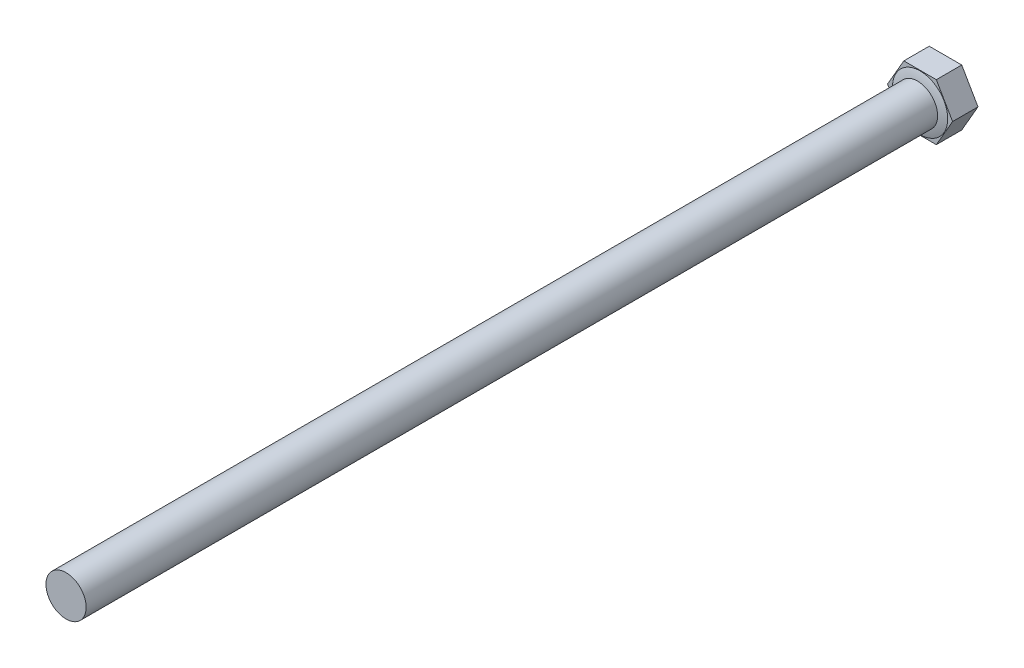
ISO-10303-21;
HEADER;
FILE_DESCRIPTION(('STEP AP214'),'2;1');
FILE_NAME('part.step','',(''),(''),'','','');
FILE_SCHEMA(('AUTOMOTIVE_DESIGN { 1 0 10303 214 1 1 1 1 }'));
ENDSEC;
DATA;
#1=APPLICATION_CONTEXT('core data for automotive mechanical design processes');
#2=APPLICATION_PROTOCOL_DEFINITION('international standard','automotive_design',2000,#1);
#3=PRODUCT_CONTEXT('',#1,'mechanical');
#4=PRODUCT('Part','Part','',(#3));
#5=PRODUCT_RELATED_PRODUCT_CATEGORY('part','',(#4));
#6=PRODUCT_DEFINITION_FORMATION('','',#4);
#7=PRODUCT_DEFINITION_CONTEXT('part definition',#1,'design');
#8=PRODUCT_DEFINITION('design','',#6,#7);
#9=PRODUCT_DEFINITION_SHAPE('','',#8);
#10=(LENGTH_UNIT() NAMED_UNIT(*) SI_UNIT(.MILLI.,.METRE.));
#11=(NAMED_UNIT(*) PLANE_ANGLE_UNIT() SI_UNIT($,.RADIAN.));
#12=(NAMED_UNIT(*) SI_UNIT($,.STERADIAN.) SOLID_ANGLE_UNIT());
#13=UNCERTAINTY_MEASURE_WITH_UNIT(LENGTH_MEASURE(1.E-05),#10,'distance_accuracy_value','');
#14=(GEOMETRIC_REPRESENTATION_CONTEXT(3) GLOBAL_UNCERTAINTY_ASSIGNED_CONTEXT((#13)) GLOBAL_UNIT_ASSIGNED_CONTEXT((#10,
#11,#12)) REPRESENTATION_CONTEXT('',''));
#15=CARTESIAN_POINT('',(0.,0.,0.));
#16=DIRECTION('',(0.,0.,1.));
#17=DIRECTION('',(1.,0.,0.));
#18=AXIS2_PLACEMENT_3D('',#15,#16,#17);
#19=CARTESIAN_POINT('',(3.15275904742978,-5.46073885417069,4.9276));
#20=DIRECTION('',(-0.866025403784441,0.499999999999995,0.));
#21=DIRECTION('',(-0.499999999999995,-0.866025403784442,0.));
#22=AXIS2_PLACEMENT_3D('',#19,#20,#21);
#23=PLANE('',#22);
#24=DIRECTION('',(0.499999999999995,0.866025403784442,0.));
#25=VECTOR('',#24,1.);
#26=CARTESIAN_POINT('',(3.15275904742978,-5.46073885417069,0.));
#27=LINE('',#26,#25);
#28=CARTESIAN_POINT('',(3.15275904742978,-5.46073885417069,0.));
#29=VERTEX_POINT('',#28);
#30=CARTESIAN_POINT('',(6.30551809485944,0.,0.));
#31=VERTEX_POINT('',#30);
#32=EDGE_CURVE('E132',#29,#31,#27,.T.);
#33=ORIENTED_EDGE('',*,*,#32,.T.);
#34=DIRECTION('',(0.,0.,-1.));
#35=VECTOR('',#34,1.);
#36=CARTESIAN_POINT('',(6.30551809485944,0.,4.9276));
#37=LINE('',#36,#35);
#38=CARTESIAN_POINT('',(6.30551809485944,0.,4.9276));
#39=VERTEX_POINT('',#38);
#40=EDGE_CURVE('E159',#39,#31,#37,.T.);
#41=ORIENTED_EDGE('',*,*,#40,.F.);
#42=DIRECTION('',(0.499999999999995,0.866025403784442,0.));
#43=VECTOR('',#42,1.);
#44=CARTESIAN_POINT('',(3.15275904742978,-5.46073885417069,4.9276));
#45=LINE('',#44,#43);
#46=CARTESIAN_POINT('',(3.15275904742978,-5.46073885417069,4.9276));
#47=VERTEX_POINT('',#46);
#48=EDGE_CURVE('E149',#47,#39,#45,.T.);
#49=ORIENTED_EDGE('',*,*,#48,.F.);
#50=DIRECTION('',(0.,0.,-1.));
#51=VECTOR('',#50,1.);
#52=CARTESIAN_POINT('',(3.15275904742978,-5.46073885417069,4.9276));
#53=LINE('',#52,#51);
#54=EDGE_CURVE('E128',#47,#29,#53,.T.);
#55=ORIENTED_EDGE('',*,*,#54,.T.);
#56=EDGE_LOOP('',(#33,#41,#49,#55));
#57=FACE_BOUND('',#56,.T.);
#58=ADVANCED_FACE('F41',(#57),#23,.F.);
#59=CARTESIAN_POINT('',(6.30551809485944,0.,4.9276));
#60=DIRECTION('',(-0.866025403784438,-0.500000000000001,0.));
#61=DIRECTION('',(0.500000000000001,-0.866025403784438,0.));
#62=AXIS2_PLACEMENT_3D('',#59,#60,#61);
#63=PLANE('',#62);
#64=DIRECTION('',(-0.500000000000001,0.866025403784438,0.));
#65=VECTOR('',#64,1.);
#66=CARTESIAN_POINT('',(6.30551809485944,0.,0.));
#67=LINE('',#66,#65);
#68=CARTESIAN_POINT('',(3.15275904742971,5.46073885417074,0.));
#69=VERTEX_POINT('',#68);
#70=EDGE_CURVE('E136',#31,#69,#67,.T.);
#71=ORIENTED_EDGE('',*,*,#70,.T.);
#72=DIRECTION('',(0.,0.,-1.));
#73=VECTOR('',#72,1.);
#74=CARTESIAN_POINT('',(3.15275904742971,5.46073885417074,4.9276));
#75=LINE('',#74,#73);
#76=CARTESIAN_POINT('',(3.15275904742971,5.46073885417074,4.9276));
#77=VERTEX_POINT('',#76);
#78=EDGE_CURVE('E156',#77,#69,#75,.T.);
#79=ORIENTED_EDGE('',*,*,#78,.F.);
#80=DIRECTION('',(-0.500000000000001,0.866025403784438,0.));
#81=VECTOR('',#80,1.);
#82=CARTESIAN_POINT('',(6.30551809485944,0.,4.9276));
#83=LINE('',#82,#81);
#84=EDGE_CURVE('E97',#39,#77,#83,.T.);
#85=ORIENTED_EDGE('',*,*,#84,.F.);
#86=ORIENTED_EDGE('',*,*,#40,.T.);
#87=EDGE_LOOP('',(#71,#79,#85,#86));
#88=FACE_BOUND('',#87,.T.);
#89=ADVANCED_FACE('F195',(#88),#63,.F.);
#90=CARTESIAN_POINT('',(3.15275904742971,5.46073885417074,4.9276));
#91=DIRECTION('',(0.,-1.,0.));
#92=DIRECTION('',(1.,0.,0.));
#93=AXIS2_PLACEMENT_3D('',#90,#91,#92);
#94=PLANE('',#93);
#95=DIRECTION('',(-1.,0.,0.));
#96=VECTOR('',#95,1.);
#97=CARTESIAN_POINT('',(3.15275904742971,5.46073885417074,0.));
#98=LINE('',#97,#96);
#99=CARTESIAN_POINT('',(-3.15275904742974,5.46073885417071,0.));
#100=VERTEX_POINT('',#99);
#101=EDGE_CURVE('E140',#69,#100,#98,.T.);
#102=ORIENTED_EDGE('',*,*,#101,.T.);
#103=DIRECTION('',(0.,0.,-1.));
#104=VECTOR('',#103,1.);
#105=CARTESIAN_POINT('',(-3.15275904742974,5.46073885417071,4.9276));
#106=LINE('',#105,#104);
#107=CARTESIAN_POINT('',(-3.15275904742974,5.46073885417071,4.9276));
#108=VERTEX_POINT('',#107);
#109=EDGE_CURVE('E121',#108,#100,#106,.T.);
#110=ORIENTED_EDGE('',*,*,#109,.F.);
#111=DIRECTION('',(-1.,0.,0.));
#112=VECTOR('',#111,1.);
#113=CARTESIAN_POINT('',(3.15275904742971,5.46073885417074,4.9276));
#114=LINE('',#113,#112);
#115=EDGE_CURVE('E110',#77,#108,#114,.T.);
#116=ORIENTED_EDGE('',*,*,#115,.F.);
#117=ORIENTED_EDGE('',*,*,#78,.T.);
#118=EDGE_LOOP('',(#102,#110,#116,#117));
#119=FACE_BOUND('',#118,.T.);
#120=ADVANCED_FACE('F200',(#119),#94,.F.);
#121=CARTESIAN_POINT('',(-3.15275904742974,5.46073885417071,4.9276));
#122=DIRECTION('',(0.866025403784441,-0.499999999999995,0.));
#123=DIRECTION('',(0.499999999999995,0.866025403784442,0.));
#124=AXIS2_PLACEMENT_3D('',#121,#122,#123);
#125=PLANE('',#124);
#126=DIRECTION('',(-0.499999999999995,-0.866025403784442,0.));
#127=VECTOR('',#126,1.);
#128=CARTESIAN_POINT('',(-3.15275904742974,5.46073885417071,0.));
#129=LINE('',#128,#127);
#130=CARTESIAN_POINT('',(-6.30551809485944,0.,0.));
#131=VERTEX_POINT('',#130);
#132=EDGE_CURVE('E119',#100,#131,#129,.T.);
#133=ORIENTED_EDGE('',*,*,#132,.T.);
#134=DIRECTION('',(0.,0.,-1.));
#135=VECTOR('',#134,1.);
#136=CARTESIAN_POINT('',(-6.30551809485944,0.,4.9276));
#137=LINE('',#136,#135);
#138=CARTESIAN_POINT('',(-6.30551809485944,0.,4.9276));
#139=VERTEX_POINT('',#138);
#140=EDGE_CURVE('E116',#139,#131,#137,.T.);
#141=ORIENTED_EDGE('',*,*,#140,.F.);
#142=DIRECTION('',(-0.499999999999995,-0.866025403784442,0.));
#143=VECTOR('',#142,1.);
#144=CARTESIAN_POINT('',(-3.15275904742974,5.46073885417071,4.9276));
#145=LINE('',#144,#143);
#146=EDGE_CURVE('E104',#108,#139,#145,.T.);
#147=ORIENTED_EDGE('',*,*,#146,.F.);
#148=ORIENTED_EDGE('',*,*,#109,.T.);
#149=EDGE_LOOP('',(#133,#141,#147,#148));
#150=FACE_BOUND('',#149,.T.);
#151=ADVANCED_FACE('F117',(#150),#125,.F.);
#152=CARTESIAN_POINT('',(-6.30551809485944,0.,4.9276));
#153=DIRECTION('',(0.866025403784435,0.500000000000007,0.));
#154=DIRECTION('',(-0.500000000000007,0.866025403784435,0.));
#155=AXIS2_PLACEMENT_3D('',#152,#153,#154);
#156=PLANE('',#155);
#157=DIRECTION('',(0.500000000000007,-0.866025403784435,0.));
#158=VECTOR('',#157,1.);
#159=CARTESIAN_POINT('',(-6.30551809485944,0.,0.));
#160=LINE('',#159,#158);
#161=CARTESIAN_POINT('',(-3.15275904742967,-5.46073885417076,0.));
#162=VERTEX_POINT('',#161);
#163=EDGE_CURVE('E82',#131,#162,#160,.T.);
#164=ORIENTED_EDGE('',*,*,#163,.T.);
#165=DIRECTION('',(0.,0.,-1.));
#166=VECTOR('',#165,1.);
#167=CARTESIAN_POINT('',(-3.15275904742967,-5.46073885417076,4.9276));
#168=LINE('',#167,#166);
#169=CARTESIAN_POINT('',(-3.15275904742967,-5.46073885417076,4.9276));
#170=VERTEX_POINT('',#169);
#171=EDGE_CURVE('E122',#170,#162,#168,.T.);
#172=ORIENTED_EDGE('',*,*,#171,.F.);
#173=DIRECTION('',(0.500000000000007,-0.866025403784435,0.));
#174=VECTOR('',#173,1.);
#175=CARTESIAN_POINT('',(-6.30551809485944,0.,4.9276));
#176=LINE('',#175,#174);
#177=EDGE_CURVE('E108',#139,#170,#176,.T.);
#178=ORIENTED_EDGE('',*,*,#177,.F.);
#179=ORIENTED_EDGE('',*,*,#140,.T.);
#180=EDGE_LOOP('',(#164,#172,#178,#179));
#181=FACE_BOUND('',#180,.T.);
#182=ADVANCED_FACE('F124',(#181),#156,.F.);
#183=CARTESIAN_POINT('',(-3.15275904742967,-5.46073885417076,4.9276));
#184=DIRECTION('',(0.,1.,0.));
#185=DIRECTION('',(-1.,0.,0.));
#186=AXIS2_PLACEMENT_3D('',#183,#184,#185);
#187=PLANE('',#186);
#188=DIRECTION('',(1.,0.,0.));
#189=VECTOR('',#188,1.);
#190=CARTESIAN_POINT('',(-3.15275904742967,-5.46073885417076,0.));
#191=LINE('',#190,#189);
#192=EDGE_CURVE('E88',#162,#29,#191,.T.);
#193=ORIENTED_EDGE('',*,*,#192,.T.);
#194=ORIENTED_EDGE('',*,*,#54,.F.);
#195=DIRECTION('',(1.,0.,0.));
#196=VECTOR('',#195,1.);
#197=CARTESIAN_POINT('',(-3.15275904742967,-5.46073885417076,4.9276));
#198=LINE('',#197,#196);
#199=EDGE_CURVE('E59',#170,#47,#198,.T.);
#200=ORIENTED_EDGE('',*,*,#199,.F.);
#201=ORIENTED_EDGE('',*,*,#171,.T.);
#202=EDGE_LOOP('',(#193,#194,#200,#201));
#203=FACE_BOUND('',#202,.T.);
#204=ADVANCED_FACE('F210',(#203),#187,.F.);
#205=CARTESIAN_POINT('',(0.,0.,4.9276));
#206=DIRECTION('',(0.,0.,1.));
#207=DIRECTION('',(1.,0.,0.));
#208=AXIS2_PLACEMENT_3D('',#205,#206,#207);
#209=PLANE('',#208);
#210=CARTESIAN_POINT('',(0.,0.,4.9276));
#211=DIRECTION('',(0.,0.,1.));
#212=DIRECTION('',(1.,0.,0.));
#213=AXIS2_PLACEMENT_3D('',#210,#211,#212);
#214=CIRCLE('',#213,5.35507043229636);
#215=CARTESIAN_POINT('',(5.35507043229636,0.,4.9276));
#216=VERTEX_POINT('',#215);
#217=EDGE_CURVE('E51',#216,#216,#214,.T.);
#218=ORIENTED_EDGE('',*,*,#217,.F.);
#219=EDGE_LOOP('',(#218));
#220=FACE_BOUND('',#219,.T.);
#221=ORIENTED_EDGE('',*,*,#48,.T.);
#222=ORIENTED_EDGE('',*,*,#84,.T.);
#223=ORIENTED_EDGE('',*,*,#115,.T.);
#224=ORIENTED_EDGE('',*,*,#146,.T.);
#225=ORIENTED_EDGE('',*,*,#177,.T.);
#226=ORIENTED_EDGE('',*,*,#199,.T.);
#227=EDGE_LOOP('',(#221,#222,#223,#224,#225,#226));
#228=FACE_BOUND('',#227,.T.);
#229=ADVANCED_FACE('F106',(#220,#228),#209,.T.);
#230=CARTESIAN_POINT('',(0.,0.,0.));
#231=DIRECTION('',(0.,0.,1.));
#232=DIRECTION('',(1.,0.,0.));
#233=AXIS2_PLACEMENT_3D('',#230,#231,#232);
#234=PLANE('',#233);
#235=ORIENTED_EDGE('',*,*,#32,.F.);
#236=ORIENTED_EDGE('',*,*,#192,.F.);
#237=ORIENTED_EDGE('',*,*,#163,.F.);
#238=ORIENTED_EDGE('',*,*,#132,.F.);
#239=ORIENTED_EDGE('',*,*,#101,.F.);
#240=ORIENTED_EDGE('',*,*,#70,.F.);
#241=EDGE_LOOP('',(#235,#236,#237,#238,#239,#240));
#242=FACE_BOUND('',#241,.T.);
#243=ADVANCED_FACE('F213',(#242),#234,.F.);
#244=CARTESIAN_POINT('',(0.,0.,-4.7371));
#245=DIRECTION('',(0.,0.,-1.));
#246=DIRECTION('',(-1.,0.,0.));
#247=AXIS2_PLACEMENT_3D('',#244,#245,#246);
#248=DEGENERATE_TOROIDAL_SURFACE('',#247,2.22151431982605,10.16,.T.);
#249=ORIENTED_EDGE('',*,*,#217,.T.);
#250=EDGE_LOOP('',(#249));
#251=FACE_BOUND('',#250,.T.);
#252=CARTESIAN_POINT('',(0.,0.,5.4229));
#253=DIRECTION('',(0.,0.,1.));
#254=DIRECTION('',(1.,0.,0.));
#255=AXIS2_PLACEMENT_3D('',#252,#253,#254);
#256=CIRCLE('',#255,2.22151431982605);
#257=CARTESIAN_POINT('',(2.22151431982605,0.,5.4229));
#258=VERTEX_POINT('',#257);
#259=EDGE_CURVE('E11',#258,#258,#256,.T.);
#260=ORIENTED_EDGE('',*,*,#259,.F.);
#261=EDGE_LOOP('',(#260));
#262=FACE_BOUND('',#261,.T.);
#263=ADVANCED_FACE('F43',(#251,#262),#248,.T.);
#264=CARTESIAN_POINT('',(0.,0.,170.5229));
#265=DIRECTION('',(0.,0.,-1.));
#266=DIRECTION('',(-1.,0.,0.));
#267=AXIS2_PLACEMENT_3D('',#264,#265,#266);
#268=CYLINDRICAL_SURFACE('',#267,3.8989);
#269=CARTESIAN_POINT('',(0.,0.,170.5229));
#270=DIRECTION('',(0.,0.,1.));
#271=DIRECTION('',(1.,0.,0.));
#272=AXIS2_PLACEMENT_3D('',#269,#270,#271);
#273=CIRCLE('',#272,3.8989);
#274=CARTESIAN_POINT('',(3.8989,0.,170.5229));
#275=VERTEX_POINT('',#274);
#276=EDGE_CURVE('E137',#275,#275,#273,.T.);
#277=ORIENTED_EDGE('',*,*,#276,.F.);
#278=EDGE_LOOP('',(#277));
#279=FACE_BOUND('',#278,.T.);
#280=CARTESIAN_POINT('',(0.,0.,5.4229));
#281=DIRECTION('',(0.,0.,1.));
#282=DIRECTION('',(1.,0.,0.));
#283=AXIS2_PLACEMENT_3D('',#280,#281,#282);
#284=CIRCLE('',#283,3.8989);
#285=CARTESIAN_POINT('',(3.8989,0.,5.4229));
#286=VERTEX_POINT('',#285);
#287=EDGE_CURVE('E169',#286,#286,#284,.T.);
#288=ORIENTED_EDGE('',*,*,#287,.T.);
#289=EDGE_LOOP('',(#288));
#290=FACE_BOUND('',#289,.T.);
#291=ADVANCED_FACE('F181',(#279,#290),#268,.T.);
#292=CARTESIAN_POINT('',(0.,0.,170.5229));
#293=DIRECTION('',(0.,0.,1.));
#294=DIRECTION('',(1.,0.,0.));
#295=AXIS2_PLACEMENT_3D('',#292,#293,#294);
#296=PLANE('',#295);
#297=ORIENTED_EDGE('',*,*,#276,.T.);
#298=EDGE_LOOP('',(#297));
#299=FACE_BOUND('',#298,.T.);
#300=ADVANCED_FACE('F185',(#299),#296,.T.);
#301=CARTESIAN_POINT('',(0.,0.,5.4229));
#302=DIRECTION('',(0.,0.,1.));
#303=DIRECTION('',(1.,0.,0.));
#304=AXIS2_PLACEMENT_3D('',#301,#302,#303);
#305=PLANE('',#304);
#306=ORIENTED_EDGE('',*,*,#259,.T.);
#307=EDGE_LOOP('',(#306));
#308=FACE_BOUND('',#307,.T.);
#309=ORIENTED_EDGE('',*,*,#287,.F.);
#310=EDGE_LOOP('',(#309));
#311=FACE_BOUND('',#310,.T.);
#312=ADVANCED_FACE('F183',(#308,#311),#305,.F.);
#313=CLOSED_SHELL('',(#58,#89,#120,#151,#182,#204,#229,#243,#263,#291,#300,#312));
#314=MANIFOLD_SOLID_BREP('B2',#313);
#315=ADVANCED_BREP_SHAPE_REPRESENTATION('',(#18,#314),#14);
#316=SHAPE_DEFINITION_REPRESENTATION(#9,#315);
ENDSEC;
END-ISO-10303-21;
